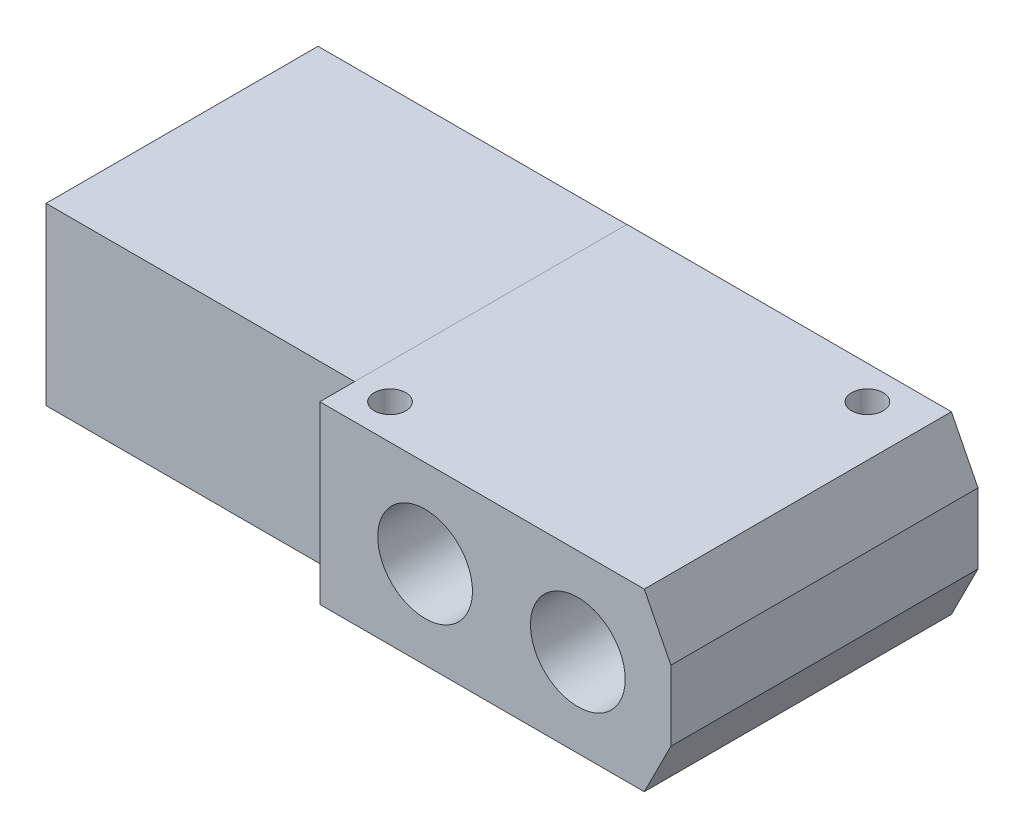
ISO-10303-21;
HEADER;
FILE_DESCRIPTION(('STEP AP214'),'2;1');
FILE_NAME('part.step','',(''),(''),'','','');
FILE_SCHEMA(('AUTOMOTIVE_DESIGN { 1 0 10303 214 1 1 1 1 }'));
ENDSEC;
DATA;
#1=APPLICATION_CONTEXT('core data for automotive mechanical design processes');
#2=APPLICATION_PROTOCOL_DEFINITION('international standard','automotive_design',2000,#1);
#3=PRODUCT_CONTEXT('',#1,'mechanical');
#4=PRODUCT('Part','Part','',(#3));
#5=PRODUCT_RELATED_PRODUCT_CATEGORY('part','',(#4));
#6=PRODUCT_DEFINITION_FORMATION('','',#4);
#7=PRODUCT_DEFINITION_CONTEXT('part definition',#1,'design');
#8=PRODUCT_DEFINITION('design','',#6,#7);
#9=PRODUCT_DEFINITION_SHAPE('','',#8);
#10=(LENGTH_UNIT() NAMED_UNIT(*) SI_UNIT(.MILLI.,.METRE.));
#11=(NAMED_UNIT(*) PLANE_ANGLE_UNIT() SI_UNIT($,.RADIAN.));
#12=(NAMED_UNIT(*) SI_UNIT($,.STERADIAN.) SOLID_ANGLE_UNIT());
#13=UNCERTAINTY_MEASURE_WITH_UNIT(LENGTH_MEASURE(1.E-05),#10,'distance_accuracy_value','');
#14=(GEOMETRIC_REPRESENTATION_CONTEXT(3) GLOBAL_UNCERTAINTY_ASSIGNED_CONTEXT((#13)) GLOBAL_UNIT_ASSIGNED_CONTEXT((#10,
#11,#12)) REPRESENTATION_CONTEXT('',''));
#15=CARTESIAN_POINT('',(0.,0.,0.));
#16=DIRECTION('',(0.,0.,1.));
#17=DIRECTION('',(1.,0.,0.));
#18=AXIS2_PLACEMENT_3D('',#15,#16,#17);
#19=CARTESIAN_POINT('',(95.504,25.4,5.08));
#20=DIRECTION('',(-1.,0.,0.));
#21=DIRECTION('',(0.,0.,1.));
#22=AXIS2_PLACEMENT_3D('',#19,#20,#21);
#23=PLANE('',#22);
#24=DIRECTION('',(0.,-1.,0.));
#25=VECTOR('',#24,1.);
#26=CARTESIAN_POINT('',(95.504,25.4,5.08));
#27=LINE('',#26,#25);
#28=CARTESIAN_POINT('',(95.504,17.78,5.08));
#29=VERTEX_POINT('',#28);
#30=CARTESIAN_POINT('',(95.504,7.62,5.08));
#31=VERTEX_POINT('',#30);
#32=EDGE_CURVE('E149',#29,#31,#27,.T.);
#33=ORIENTED_EDGE('',*,*,#32,.T.);
#34=DIRECTION('',(0.,0.,1.));
#35=VECTOR('',#34,1.);
#36=CARTESIAN_POINT('',(95.504,7.62,-39.37));
#37=LINE('',#36,#35);
#38=CARTESIAN_POINT('',(95.504,7.62,-39.37));
#39=VERTEX_POINT('',#38);
#40=EDGE_CURVE('E124',#39,#31,#37,.T.);
#41=ORIENTED_EDGE('',*,*,#40,.F.);
#42=DIRECTION('',(0.,-1.,0.));
#43=VECTOR('',#42,1.);
#44=CARTESIAN_POINT('',(95.504,25.4,-39.37));
#45=LINE('',#44,#43);
#46=CARTESIAN_POINT('',(95.504,17.78,-39.37));
#47=VERTEX_POINT('',#46);
#48=EDGE_CURVE('E11',#47,#39,#45,.T.);
#49=ORIENTED_EDGE('',*,*,#48,.F.);
#50=DIRECTION('',(0.,0.,1.));
#51=VECTOR('',#50,1.);
#52=CARTESIAN_POINT('',(95.504,17.78,-39.37));
#53=LINE('',#52,#51);
#54=EDGE_CURVE('E212',#47,#29,#53,.T.);
#55=ORIENTED_EDGE('',*,*,#54,.T.);
#56=EDGE_LOOP('',(#33,#41,#49,#55));
#57=FACE_BOUND('',#56,.T.);
#58=ADVANCED_FACE('F33',(#57),#23,.F.);
#59=CARTESIAN_POINT('',(0.,25.4,-39.37));
#60=DIRECTION('',(0.,0.,1.));
#61=DIRECTION('',(1.,0.,0.));
#62=AXIS2_PLACEMENT_3D('',#59,#60,#61);
#63=PLANE('',#62);
#64=CARTESIAN_POINT('',(69.85,12.7,-39.37));
#65=DIRECTION('',(0.,0.,-1.));
#66=DIRECTION('',(-1.,0.,0.));
#67=AXIS2_PLACEMENT_3D('',#64,#65,#66);
#68=CIRCLE('',#67,6.8545837);
#69=CARTESIAN_POINT('',(62.9954163,12.7,-39.37));
#70=VERTEX_POINT('',#69);
#71=EDGE_CURVE('E239',#70,#70,#68,.T.);
#72=ORIENTED_EDGE('',*,*,#71,.F.);
#73=EDGE_LOOP('',(#72));
#74=FACE_BOUND('',#73,.T.);
#75=ORIENTED_EDGE('',*,*,#48,.T.);
#76=DIRECTION('',(-0.450373433442575,-0.892840282720906,0.));
#77=VECTOR('',#76,1.);
#78=CARTESIAN_POINT('',(95.504,7.62,-39.37));
#79=LINE('',#78,#77);
#80=CARTESIAN_POINT('',(91.6602603869373,0.,-39.37));
#81=VERTEX_POINT('',#80);
#82=EDGE_CURVE('E118',#39,#81,#79,.T.);
#83=ORIENTED_EDGE('',*,*,#82,.T.);
#84=DIRECTION('',(-1.,0.,0.));
#85=VECTOR('',#84,1.);
#86=CARTESIAN_POINT('',(0.,0.,-39.37));
#87=LINE('',#86,#85);
#88=CARTESIAN_POINT('',(44.704,0.,-39.37));
#89=VERTEX_POINT('',#88);
#90=EDGE_CURVE('E129',#81,#89,#87,.T.);
#91=ORIENTED_EDGE('',*,*,#90,.T.);
#92=DIRECTION('',(0.,1.,0.));
#93=VECTOR('',#92,1.);
#94=CARTESIAN_POINT('',(44.704,0.,-39.37));
#95=LINE('',#94,#93);
#96=CARTESIAN_POINT('',(44.704,0.0254000000000018,-39.37));
#97=VERTEX_POINT('',#96);
#98=EDGE_CURVE('E174',#89,#97,#95,.T.);
#99=ORIENTED_EDGE('',*,*,#98,.T.);
#100=DIRECTION('',(-1.,0.,0.));
#101=VECTOR('',#100,1.);
#102=CARTESIAN_POINT('',(0.,0.0254000000000001,-39.37));
#103=LINE('',#102,#101);
#104=CARTESIAN_POINT('',(0.,0.0254000000000001,-39.37));
#105=VERTEX_POINT('',#104);
#106=EDGE_CURVE('E173',#97,#105,#103,.T.);
#107=ORIENTED_EDGE('',*,*,#106,.T.);
#108=DIRECTION('',(0.,-1.,0.));
#109=VECTOR('',#108,1.);
#110=CARTESIAN_POINT('',(0.,25.4,-39.37));
#111=LINE('',#110,#109);
#112=CARTESIAN_POINT('',(0.,25.3746,-39.37));
#113=VERTEX_POINT('',#112);
#114=EDGE_CURVE('E40',#113,#105,#111,.T.);
#115=ORIENTED_EDGE('',*,*,#114,.F.);
#116=DIRECTION('',(1.,0.,0.));
#117=VECTOR('',#116,1.);
#118=CARTESIAN_POINT('',(0.,25.3746,-39.37));
#119=LINE('',#118,#117);
#120=CARTESIAN_POINT('',(44.704,25.3746,-39.37));
#121=VERTEX_POINT('',#120);
#122=EDGE_CURVE('E171',#113,#121,#119,.T.);
#123=ORIENTED_EDGE('',*,*,#122,.T.);
#124=DIRECTION('',(0.,1.,0.));
#125=VECTOR('',#124,1.);
#126=CARTESIAN_POINT('',(44.704,25.4,-39.37));
#127=LINE('',#126,#125);
#128=CARTESIAN_POINT('',(44.704,25.4,-39.37));
#129=VERTEX_POINT('',#128);
#130=EDGE_CURVE('E188',#121,#129,#127,.T.);
#131=ORIENTED_EDGE('',*,*,#130,.T.);
#132=DIRECTION('',(-1.,0.,0.));
#133=VECTOR('',#132,1.);
#134=CARTESIAN_POINT('',(0.,25.4,-39.37));
#135=LINE('',#134,#133);
#136=CARTESIAN_POINT('',(91.6602603869373,25.4,-39.37));
#137=VERTEX_POINT('',#136);
#138=EDGE_CURVE('E148',#137,#129,#135,.T.);
#139=ORIENTED_EDGE('',*,*,#138,.F.);
#140=DIRECTION('',(0.450373433442575,-0.892840282720906,0.));
#141=VECTOR('',#140,1.);
#142=CARTESIAN_POINT('',(95.504,17.78,-39.37));
#143=LINE('',#142,#141);
#144=EDGE_CURVE('E55',#137,#47,#143,.T.);
#145=ORIENTED_EDGE('',*,*,#144,.T.);
#146=EDGE_LOOP('',(#75,#83,#91,#99,#107,#115,#123,#131,#139,#145));
#147=FACE_BOUND('',#146,.T.);
#148=ADVANCED_FACE('F127',(#74,#147),#63,.F.);
#149=CARTESIAN_POINT('',(0.,25.4,0.));
#150=DIRECTION('',(1.,0.,0.));
#151=DIRECTION('',(0.,0.,-1.));
#152=AXIS2_PLACEMENT_3D('',#149,#150,#151);
#153=PLANE('',#152);
#154=ORIENTED_EDGE('',*,*,#114,.T.);
#155=DIRECTION('',(0.,0.,1.));
#156=VECTOR('',#155,1.);
#157=CARTESIAN_POINT('',(0.,0.0254000000000001,-39.37));
#158=LINE('',#157,#156);
#159=CARTESIAN_POINT('',(0.,0.0254000000000001,0.));
#160=VERTEX_POINT('',#159);
#161=EDGE_CURVE('E167',#105,#160,#158,.T.);
#162=ORIENTED_EDGE('',*,*,#161,.T.);
#163=DIRECTION('',(0.,-1.,0.));
#164=VECTOR('',#163,1.);
#165=CARTESIAN_POINT('',(0.,25.4,0.));
#166=LINE('',#165,#164);
#167=CARTESIAN_POINT('',(0.,25.3746,0.));
#168=VERTEX_POINT('',#167);
#169=EDGE_CURVE('E158',#168,#160,#166,.T.);
#170=ORIENTED_EDGE('',*,*,#169,.F.);
#171=DIRECTION('',(0.,0.,1.));
#172=VECTOR('',#171,1.);
#173=CARTESIAN_POINT('',(0.,25.3746,-39.37));
#174=LINE('',#173,#172);
#175=EDGE_CURVE('E141',#113,#168,#174,.T.);
#176=ORIENTED_EDGE('',*,*,#175,.F.);
#177=EDGE_LOOP('',(#154,#162,#170,#176));
#178=FACE_BOUND('',#177,.T.);
#179=ADVANCED_FACE('F165',(#178),#153,.F.);
#180=CARTESIAN_POINT('',(0.,25.4,0.));
#181=DIRECTION('',(0.,0.,-1.));
#182=DIRECTION('',(-1.,0.,0.));
#183=AXIS2_PLACEMENT_3D('',#180,#181,#182);
#184=PLANE('',#183);
#185=ORIENTED_EDGE('',*,*,#169,.T.);
#186=DIRECTION('',(-1.,0.,0.));
#187=VECTOR('',#186,1.);
#188=CARTESIAN_POINT('',(0.,0.0254000000000001,0.));
#189=LINE('',#188,#187);
#190=CARTESIAN_POINT('',(44.704,0.0254000000000018,0.));
#191=VERTEX_POINT('',#190);
#192=EDGE_CURVE('E179',#191,#160,#189,.T.);
#193=ORIENTED_EDGE('',*,*,#192,.F.);
#194=DIRECTION('',(0.,-1.,0.));
#195=VECTOR('',#194,1.);
#196=CARTESIAN_POINT('',(44.704,25.4,0.));
#197=LINE('',#196,#195);
#198=CARTESIAN_POINT('',(44.704,25.3746,0.));
#199=VERTEX_POINT('',#198);
#200=EDGE_CURVE('E155',#199,#191,#197,.T.);
#201=ORIENTED_EDGE('',*,*,#200,.F.);
#202=DIRECTION('',(1.,0.,0.));
#203=VECTOR('',#202,1.);
#204=CARTESIAN_POINT('',(0.,25.3746,0.));
#205=LINE('',#204,#203);
#206=EDGE_CURVE('E185',#168,#199,#205,.T.);
#207=ORIENTED_EDGE('',*,*,#206,.F.);
#208=EDGE_LOOP('',(#185,#193,#201,#207));
#209=FACE_BOUND('',#208,.T.);
#210=ADVANCED_FACE('F291',(#209),#184,.F.);
#211=CARTESIAN_POINT('',(44.704,25.4,5.08));
#212=DIRECTION('',(1.,0.,0.));
#213=DIRECTION('',(0.,0.,-1.));
#214=AXIS2_PLACEMENT_3D('',#211,#212,#213);
#215=PLANE('',#214);
#216=DIRECTION('',(0.,0.,1.));
#217=VECTOR('',#216,1.);
#218=CARTESIAN_POINT('',(44.704,0.,5.08));
#219=LINE('',#218,#217);
#220=CARTESIAN_POINT('',(44.704,0.,5.08));
#221=VERTEX_POINT('',#220);
#222=EDGE_CURVE('E135',#89,#221,#219,.T.);
#223=ORIENTED_EDGE('',*,*,#222,.T.);
#224=DIRECTION('',(0.,-1.,0.));
#225=VECTOR('',#224,1.);
#226=CARTESIAN_POINT('',(44.704,25.4,5.08));
#227=LINE('',#226,#225);
#228=CARTESIAN_POINT('',(44.704,25.4,5.08));
#229=VERTEX_POINT('',#228);
#230=EDGE_CURVE('E152',#229,#221,#227,.T.);
#231=ORIENTED_EDGE('',*,*,#230,.F.);
#232=DIRECTION('',(0.,0.,1.));
#233=VECTOR('',#232,1.);
#234=CARTESIAN_POINT('',(44.704,25.4,5.08));
#235=LINE('',#234,#233);
#236=EDGE_CURVE('E193',#129,#229,#235,.T.);
#237=ORIENTED_EDGE('',*,*,#236,.F.);
#238=ORIENTED_EDGE('',*,*,#130,.F.);
#239=DIRECTION('',(0.,0.,1.));
#240=VECTOR('',#239,1.);
#241=CARTESIAN_POINT('',(44.704,25.3746,-39.37));
#242=LINE('',#241,#240);
#243=EDGE_CURVE('E137',#121,#199,#242,.T.);
#244=ORIENTED_EDGE('',*,*,#243,.T.);
#245=ORIENTED_EDGE('',*,*,#200,.T.);
#246=DIRECTION('',(0.,0.,1.));
#247=VECTOR('',#246,1.);
#248=CARTESIAN_POINT('',(44.704,0.0254000000000018,-39.37));
#249=LINE('',#248,#247);
#250=EDGE_CURVE('E176',#97,#191,#249,.T.);
#251=ORIENTED_EDGE('',*,*,#250,.F.);
#252=ORIENTED_EDGE('',*,*,#98,.F.);
#253=EDGE_LOOP('',(#223,#231,#237,#238,#244,#245,#251,#252));
#254=FACE_BOUND('',#253,.T.);
#255=ADVANCED_FACE('F273',(#254),#215,.F.);
#256=CARTESIAN_POINT('',(44.704,25.4,5.08));
#257=DIRECTION('',(0.,0.,-1.));
#258=DIRECTION('',(-1.,0.,0.));
#259=AXIS2_PLACEMENT_3D('',#256,#257,#258);
#260=PLANE('',#259);
#261=CARTESIAN_POINT('',(59.944,12.7,5.08000000000001));
#262=DIRECTION('',(0.,0.,1.));
#263=DIRECTION('',(1.,0.,0.));
#264=AXIS2_PLACEMENT_3D('',#261,#262,#263);
#265=CIRCLE('',#264,6.8545837);
#266=CARTESIAN_POINT('',(66.7985837,12.7,5.08000000000001));
#267=VERTEX_POINT('',#266);
#268=EDGE_CURVE('E214',#267,#267,#265,.T.);
#269=ORIENTED_EDGE('',*,*,#268,.F.);
#270=EDGE_LOOP('',(#269));
#271=FACE_BOUND('',#270,.T.);
#272=CARTESIAN_POINT('',(82.042,12.7,5.08000000000001));
#273=DIRECTION('',(0.,0.,1.));
#274=DIRECTION('',(1.,0.,0.));
#275=AXIS2_PLACEMENT_3D('',#272,#273,#274);
#276=CIRCLE('',#275,6.8545837);
#277=CARTESIAN_POINT('',(88.8965837,12.7,5.08000000000001));
#278=VERTEX_POINT('',#277);
#279=EDGE_CURVE('E227',#278,#278,#276,.T.);
#280=ORIENTED_EDGE('',*,*,#279,.F.);
#281=EDGE_LOOP('',(#280));
#282=FACE_BOUND('',#281,.T.);
#283=DIRECTION('',(1.,0.,0.));
#284=VECTOR('',#283,1.);
#285=CARTESIAN_POINT('',(44.704,0.,5.08));
#286=LINE('',#285,#284);
#287=CARTESIAN_POINT('',(91.6602603869373,0.,5.08));
#288=VERTEX_POINT('',#287);
#289=EDGE_CURVE('E139',#221,#288,#286,.T.);
#290=ORIENTED_EDGE('',*,*,#289,.T.);
#291=DIRECTION('',(-0.450373433442575,-0.892840282720906,0.));
#292=VECTOR('',#291,1.);
#293=CARTESIAN_POINT('',(95.504,7.62,5.08));
#294=LINE('',#293,#292);
#295=EDGE_CURVE('E47',#31,#288,#294,.T.);
#296=ORIENTED_EDGE('',*,*,#295,.F.);
#297=ORIENTED_EDGE('',*,*,#32,.F.);
#298=DIRECTION('',(0.450373433442575,-0.892840282720906,0.));
#299=VECTOR('',#298,1.);
#300=CARTESIAN_POINT('',(95.504,17.78,5.08));
#301=LINE('',#300,#299);
#302=CARTESIAN_POINT('',(91.6602603869373,25.4,5.08));
#303=VERTEX_POINT('',#302);
#304=EDGE_CURVE('E206',#303,#29,#301,.T.);
#305=ORIENTED_EDGE('',*,*,#304,.F.);
#306=DIRECTION('',(1.,0.,0.));
#307=VECTOR('',#306,1.);
#308=CARTESIAN_POINT('',(44.704,25.4,5.08));
#309=LINE('',#308,#307);
#310=EDGE_CURVE('E144',#229,#303,#309,.T.);
#311=ORIENTED_EDGE('',*,*,#310,.F.);
#312=ORIENTED_EDGE('',*,*,#230,.T.);
#313=EDGE_LOOP('',(#290,#296,#297,#305,#311,#312));
#314=FACE_BOUND('',#313,.T.);
#315=ADVANCED_FACE('F204',(#271,#282,#314),#260,.F.);
#316=CARTESIAN_POINT('',(0.,25.4,0.));
#317=DIRECTION('',(0.,-1.,0.));
#318=DIRECTION('',(0.,0.,-1.));
#319=AXIS2_PLACEMENT_3D('',#316,#317,#318);
#320=PLANE('',#319);
#321=CARTESIAN_POINT('',(84.328,25.4,-34.544));
#322=DIRECTION('',(0.,1.,0.));
#323=DIRECTION('',(0.,0.,1.));
#324=AXIS2_PLACEMENT_3D('',#321,#322,#323);
#325=CIRCLE('',#324,2.28599999999999);
#326=CARTESIAN_POINT('',(84.328,25.4,-32.258));
#327=VERTEX_POINT('',#326);
#328=EDGE_CURVE('E251',#327,#327,#325,.T.);
#329=ORIENTED_EDGE('',*,*,#328,.F.);
#330=EDGE_LOOP('',(#329));
#331=FACE_BOUND('',#330,.T.);
#332=CARTESIAN_POINT('',(49.784,25.4,0.));
#333=DIRECTION('',(0.,1.,0.));
#334=DIRECTION('',(0.,0.,1.));
#335=AXIS2_PLACEMENT_3D('',#332,#333,#334);
#336=CIRCLE('',#335,2.28599999999999);
#337=CARTESIAN_POINT('',(49.784,25.4,2.286));
#338=VERTEX_POINT('',#337);
#339=EDGE_CURVE('E255',#338,#338,#336,.T.);
#340=ORIENTED_EDGE('',*,*,#339,.F.);
#341=EDGE_LOOP('',(#340));
#342=FACE_BOUND('',#341,.T.);
#343=ORIENTED_EDGE('',*,*,#310,.T.);
#344=DIRECTION('',(0.,0.,1.));
#345=VECTOR('',#344,1.);
#346=CARTESIAN_POINT('',(91.6602603869373,25.4,-39.37));
#347=LINE('',#346,#345);
#348=EDGE_CURVE('E200',#137,#303,#347,.T.);
#349=ORIENTED_EDGE('',*,*,#348,.F.);
#350=ORIENTED_EDGE('',*,*,#138,.T.);
#351=ORIENTED_EDGE('',*,*,#236,.T.);
#352=EDGE_LOOP('',(#343,#349,#350,#351));
#353=FACE_BOUND('',#352,.T.);
#354=ADVANCED_FACE('F199',(#331,#342,#353),#320,.F.);
#355=CARTESIAN_POINT('',(0.,0.,0.));
#356=DIRECTION('',(0.,-1.,0.));
#357=DIRECTION('',(0.,0.,-1.));
#358=AXIS2_PLACEMENT_3D('',#355,#356,#357);
#359=PLANE('',#358);
#360=DIRECTION('',(0.,0.,1.));
#361=VECTOR('',#360,1.);
#362=CARTESIAN_POINT('',(91.6602603869373,0.,-39.37));
#363=LINE('',#362,#361);
#364=EDGE_CURVE('E115',#81,#288,#363,.T.);
#365=ORIENTED_EDGE('',*,*,#364,.T.);
#366=ORIENTED_EDGE('',*,*,#289,.F.);
#367=ORIENTED_EDGE('',*,*,#222,.F.);
#368=ORIENTED_EDGE('',*,*,#90,.F.);
#369=EDGE_LOOP('',(#365,#366,#367,#368));
#370=FACE_BOUND('',#369,.T.);
#371=CARTESIAN_POINT('',(84.328,0.,-34.544));
#372=DIRECTION('',(0.,1.,0.));
#373=DIRECTION('',(0.,0.,1.));
#374=AXIS2_PLACEMENT_3D('',#371,#372,#373);
#375=CIRCLE('',#374,2.28599999999999);
#376=CARTESIAN_POINT('',(84.328,0.,-32.258));
#377=VERTEX_POINT('',#376);
#378=EDGE_CURVE('E252',#377,#377,#375,.T.);
#379=ORIENTED_EDGE('',*,*,#378,.T.);
#380=EDGE_LOOP('',(#379));
#381=FACE_BOUND('',#380,.T.);
#382=CARTESIAN_POINT('',(49.784,0.,0.));
#383=DIRECTION('',(0.,1.,0.));
#384=DIRECTION('',(0.,0.,1.));
#385=AXIS2_PLACEMENT_3D('',#382,#383,#384);
#386=CIRCLE('',#385,2.28599999999999);
#387=CARTESIAN_POINT('',(49.784,0.,2.286));
#388=VERTEX_POINT('',#387);
#389=EDGE_CURVE('E184',#388,#388,#386,.T.);
#390=ORIENTED_EDGE('',*,*,#389,.T.);
#391=EDGE_LOOP('',(#390));
#392=FACE_BOUND('',#391,.T.);
#393=ADVANCED_FACE('F133',(#370,#381,#392),#359,.T.);
#394=CARTESIAN_POINT('',(0.,25.3746,-39.37));
#395=DIRECTION('',(0.,-1.,0.));
#396=DIRECTION('',(0.,0.,-1.));
#397=AXIS2_PLACEMENT_3D('',#394,#395,#396);
#398=PLANE('',#397);
#399=ORIENTED_EDGE('',*,*,#206,.T.);
#400=ORIENTED_EDGE('',*,*,#243,.F.);
#401=ORIENTED_EDGE('',*,*,#122,.F.);
#402=ORIENTED_EDGE('',*,*,#175,.T.);
#403=EDGE_LOOP('',(#399,#400,#401,#402));
#404=FACE_BOUND('',#403,.T.);
#405=ADVANCED_FACE('F271',(#404),#398,.F.);
#406=CARTESIAN_POINT('',(0.,0.0254000000000001,-39.37));
#407=DIRECTION('',(0.,1.,0.));
#408=DIRECTION('',(-1.,0.,0.));
#409=AXIS2_PLACEMENT_3D('',#406,#407,#408);
#410=PLANE('',#409);
#411=ORIENTED_EDGE('',*,*,#192,.T.);
#412=ORIENTED_EDGE('',*,*,#161,.F.);
#413=ORIENTED_EDGE('',*,*,#106,.F.);
#414=ORIENTED_EDGE('',*,*,#250,.T.);
#415=EDGE_LOOP('',(#411,#412,#413,#414));
#416=FACE_BOUND('',#415,.T.);
#417=ADVANCED_FACE('F289',(#416),#410,.F.);
#418=CARTESIAN_POINT('',(49.784,0.,0.));
#419=DIRECTION('',(0.,1.,0.));
#420=DIRECTION('',(0.,0.,1.));
#421=AXIS2_PLACEMENT_3D('',#418,#419,#420);
#422=CYLINDRICAL_SURFACE('',#421,2.28599999999999);
#423=ORIENTED_EDGE('',*,*,#389,.F.);
#424=EDGE_LOOP('',(#423));
#425=FACE_BOUND('',#424,.T.);
#426=ORIENTED_EDGE('',*,*,#339,.T.);
#427=EDGE_LOOP('',(#426));
#428=FACE_BOUND('',#427,.T.);
#429=ADVANCED_FACE('F262',(#425,#428),#422,.F.);
#430=CARTESIAN_POINT('',(84.328,0.,-34.544));
#431=DIRECTION('',(0.,1.,0.));
#432=DIRECTION('',(0.,0.,1.));
#433=AXIS2_PLACEMENT_3D('',#430,#431,#432);
#434=CYLINDRICAL_SURFACE('',#433,2.28599999999999);
#435=ORIENTED_EDGE('',*,*,#378,.F.);
#436=EDGE_LOOP('',(#435));
#437=FACE_BOUND('',#436,.T.);
#438=ORIENTED_EDGE('',*,*,#328,.T.);
#439=EDGE_LOOP('',(#438));
#440=FACE_BOUND('',#439,.T.);
#441=ADVANCED_FACE('F302',(#437,#440),#434,.F.);
#442=CARTESIAN_POINT('',(69.85,12.7,-22.352));
#443=DIRECTION('',(0.,0.,-1.));
#444=DIRECTION('',(-1.,0.,0.));
#445=AXIS2_PLACEMENT_3D('',#442,#443,#444);
#446=CONICAL_SURFACE('',#445,5.56260000000001,1.02974425867665);
#447=CARTESIAN_POINT('',(69.85,12.7,-19.0096527205973));
#448=VERTEX_POINT('',#447);
#449=VERTEX_LOOP('',#448);
#450=FACE_BOUND('',#449,.T.);
#451=CARTESIAN_POINT('',(69.85,12.7,-22.352));
#452=DIRECTION('',(0.,0.,-1.));
#453=DIRECTION('',(-1.,0.,0.));
#454=AXIS2_PLACEMENT_3D('',#451,#452,#453);
#455=CIRCLE('',#454,5.56260000000001);
#456=CARTESIAN_POINT('',(64.2874,12.7,-22.352));
#457=VERTEX_POINT('',#456);
#458=EDGE_CURVE('E248',#457,#457,#455,.T.);
#459=ORIENTED_EDGE('',*,*,#458,.T.);
#460=EDGE_LOOP('',(#459));
#461=FACE_BOUND('',#460,.T.);
#462=ADVANCED_FACE('F306',(#450,#461),#446,.F.);
#463=CARTESIAN_POINT('',(69.85,12.7,-39.37));
#464=DIRECTION('',(0.,0.,-1.));
#465=DIRECTION('',(-1.,0.,0.));
#466=AXIS2_PLACEMENT_3D('',#463,#464,#465);
#467=CYLINDRICAL_SURFACE('',#466,5.56260000000001);
#468=ORIENTED_EDGE('',*,*,#458,.F.);
#469=EDGE_LOOP('',(#468));
#470=FACE_BOUND('',#469,.T.);
#471=CARTESIAN_POINT('',(69.85,12.7,-29.464));
#472=DIRECTION('',(0.,0.,-1.));
#473=DIRECTION('',(-1.,0.,0.));
#474=AXIS2_PLACEMENT_3D('',#471,#472,#473);
#475=CIRCLE('',#474,5.5626);
#476=CARTESIAN_POINT('',(64.2874,12.7,-29.464));
#477=VERTEX_POINT('',#476);
#478=EDGE_CURVE('E245',#477,#477,#475,.T.);
#479=ORIENTED_EDGE('',*,*,#478,.T.);
#480=EDGE_LOOP('',(#479));
#481=FACE_BOUND('',#480,.T.);
#482=ADVANCED_FACE('F310',(#470,#481),#467,.F.);
#483=CARTESIAN_POINT('',(75.4126,12.7,-29.464));
#484=DIRECTION('',(0.,0.,1.));
#485=DIRECTION('',(1.,0.,0.));
#486=AXIS2_PLACEMENT_3D('',#483,#484,#485);
#487=PLANE('',#486);
#488=ORIENTED_EDGE('',*,*,#478,.F.);
#489=EDGE_LOOP('',(#488));
#490=FACE_BOUND('',#489,.T.);
#491=CARTESIAN_POINT('',(69.85,12.7,-29.464));
#492=DIRECTION('',(0.,0.,-1.));
#493=DIRECTION('',(-1.,0.,0.));
#494=AXIS2_PLACEMENT_3D('',#491,#492,#493);
#495=CIRCLE('',#494,6.55798479417671);
#496=CARTESIAN_POINT('',(63.2920152058233,12.7,-29.464));
#497=VERTEX_POINT('',#496);
#498=EDGE_CURVE('E242',#497,#497,#495,.T.);
#499=ORIENTED_EDGE('',*,*,#498,.T.);
#500=EDGE_LOOP('',(#499));
#501=FACE_BOUND('',#500,.T.);
#502=ADVANCED_FACE('F314',(#490,#501),#487,.F.);
#503=CARTESIAN_POINT('',(69.85,12.7,-39.37));
#504=DIRECTION('',(0.,0.,-1.));
#505=DIRECTION('',(-1.,0.,0.));
#506=AXIS2_PLACEMENT_3D('',#503,#504,#505);
#507=CONICAL_SURFACE('',#506,6.8545837,0.0299323966717032);
#508=ORIENTED_EDGE('',*,*,#498,.F.);
#509=EDGE_LOOP('',(#508));
#510=FACE_BOUND('',#509,.T.);
#511=ORIENTED_EDGE('',*,*,#71,.T.);
#512=EDGE_LOOP('',(#511));
#513=FACE_BOUND('',#512,.T.);
#514=ADVANCED_FACE('F318',(#510,#513),#507,.F.);
#515=CARTESIAN_POINT('',(82.042,12.7,-11.938));
#516=DIRECTION('',(0.,0.,1.));
#517=DIRECTION('',(1.,0.,0.));
#518=AXIS2_PLACEMENT_3D('',#515,#516,#517);
#519=CONICAL_SURFACE('',#518,5.56260000000001,1.02974425867665);
#520=CARTESIAN_POINT('',(82.042,12.7,-15.2803472794027));
#521=VERTEX_POINT('',#520);
#522=VERTEX_LOOP('',#521);
#523=FACE_BOUND('',#522,.T.);
#524=CARTESIAN_POINT('',(82.042,12.7,-11.938));
#525=DIRECTION('',(0.,0.,1.));
#526=DIRECTION('',(1.,0.,0.));
#527=AXIS2_PLACEMENT_3D('',#524,#525,#526);
#528=CIRCLE('',#527,5.56260000000001);
#529=CARTESIAN_POINT('',(87.6046,12.7,-11.938));
#530=VERTEX_POINT('',#529);
#531=EDGE_CURVE('E236',#530,#530,#528,.T.);
#532=ORIENTED_EDGE('',*,*,#531,.T.);
#533=EDGE_LOOP('',(#532));
#534=FACE_BOUND('',#533,.T.);
#535=ADVANCED_FACE('F322',(#523,#534),#519,.F.);
#536=CARTESIAN_POINT('',(82.042,12.7,5.08));
#537=DIRECTION('',(0.,0.,1.));
#538=DIRECTION('',(1.,0.,0.));
#539=AXIS2_PLACEMENT_3D('',#536,#537,#538);
#540=CYLINDRICAL_SURFACE('',#539,5.56260000000001);
#541=ORIENTED_EDGE('',*,*,#531,.F.);
#542=EDGE_LOOP('',(#541));
#543=FACE_BOUND('',#542,.T.);
#544=CARTESIAN_POINT('',(82.042,12.7,-4.826));
#545=DIRECTION('',(0.,0.,1.));
#546=DIRECTION('',(1.,0.,0.));
#547=AXIS2_PLACEMENT_3D('',#544,#545,#546);
#548=CIRCLE('',#547,5.5626);
#549=CARTESIAN_POINT('',(87.6046,12.7,-4.826));
#550=VERTEX_POINT('',#549);
#551=EDGE_CURVE('E233',#550,#550,#548,.T.);
#552=ORIENTED_EDGE('',*,*,#551,.T.);
#553=EDGE_LOOP('',(#552));
#554=FACE_BOUND('',#553,.T.);
#555=ADVANCED_FACE('F326',(#543,#554),#540,.F.);
#556=CARTESIAN_POINT('',(87.6046,12.7,-4.826));
#557=DIRECTION('',(0.,0.,-1.));
#558=DIRECTION('',(-1.,0.,0.));
#559=AXIS2_PLACEMENT_3D('',#556,#557,#558);
#560=PLANE('',#559);
#561=ORIENTED_EDGE('',*,*,#551,.F.);
#562=EDGE_LOOP('',(#561));
#563=FACE_BOUND('',#562,.T.);
#564=CARTESIAN_POINT('',(82.042,12.7,-4.826));
#565=DIRECTION('',(0.,0.,1.));
#566=DIRECTION('',(1.,0.,0.));
#567=AXIS2_PLACEMENT_3D('',#564,#565,#566);
#568=CIRCLE('',#567,6.55798479417671);
#569=CARTESIAN_POINT('',(88.5999847941767,12.7,-4.826));
#570=VERTEX_POINT('',#569);
#571=EDGE_CURVE('E230',#570,#570,#568,.T.);
#572=ORIENTED_EDGE('',*,*,#571,.T.);
#573=EDGE_LOOP('',(#572));
#574=FACE_BOUND('',#573,.T.);
#575=ADVANCED_FACE('F330',(#563,#574),#560,.F.);
#576=CARTESIAN_POINT('',(82.042,12.7,5.08000000000001));
#577=DIRECTION('',(0.,0.,1.));
#578=DIRECTION('',(1.,0.,0.));
#579=AXIS2_PLACEMENT_3D('',#576,#577,#578);
#580=CONICAL_SURFACE('',#579,6.8545837,0.0299323966717032);
#581=ORIENTED_EDGE('',*,*,#571,.F.);
#582=EDGE_LOOP('',(#581));
#583=FACE_BOUND('',#582,.T.);
#584=ORIENTED_EDGE('',*,*,#279,.T.);
#585=EDGE_LOOP('',(#584));
#586=FACE_BOUND('',#585,.T.);
#587=ADVANCED_FACE('F334',(#583,#586),#580,.F.);
#588=CARTESIAN_POINT('',(59.944,12.7,-11.938));
#589=DIRECTION('',(0.,0.,1.));
#590=DIRECTION('',(1.,0.,0.));
#591=AXIS2_PLACEMENT_3D('',#588,#589,#590);
#592=CONICAL_SURFACE('',#591,5.56260000000001,1.02974425867665);
#593=CARTESIAN_POINT('',(59.944,12.7,-15.2803472794027));
#594=VERTEX_POINT('',#593);
#595=VERTEX_LOOP('',#594);
#596=FACE_BOUND('',#595,.T.);
#597=CARTESIAN_POINT('',(59.944,12.7,-11.938));
#598=DIRECTION('',(0.,0.,1.));
#599=DIRECTION('',(1.,0.,0.));
#600=AXIS2_PLACEMENT_3D('',#597,#598,#599);
#601=CIRCLE('',#600,5.56260000000001);
#602=CARTESIAN_POINT('',(65.5066,12.7,-11.938));
#603=VERTEX_POINT('',#602);
#604=EDGE_CURVE('E224',#603,#603,#601,.T.);
#605=ORIENTED_EDGE('',*,*,#604,.T.);
#606=EDGE_LOOP('',(#605));
#607=FACE_BOUND('',#606,.T.);
#608=ADVANCED_FACE('F338',(#596,#607),#592,.F.);
#609=CARTESIAN_POINT('',(59.944,12.7,5.08));
#610=DIRECTION('',(0.,0.,1.));
#611=DIRECTION('',(1.,0.,0.));
#612=AXIS2_PLACEMENT_3D('',#609,#610,#611);
#613=CYLINDRICAL_SURFACE('',#612,5.56260000000001);
#614=ORIENTED_EDGE('',*,*,#604,.F.);
#615=EDGE_LOOP('',(#614));
#616=FACE_BOUND('',#615,.T.);
#617=CARTESIAN_POINT('',(59.944,12.7,-4.826));
#618=DIRECTION('',(0.,0.,1.));
#619=DIRECTION('',(1.,0.,0.));
#620=AXIS2_PLACEMENT_3D('',#617,#618,#619);
#621=CIRCLE('',#620,5.5626);
#622=CARTESIAN_POINT('',(65.5066,12.7,-4.826));
#623=VERTEX_POINT('',#622);
#624=EDGE_CURVE('E221',#623,#623,#621,.T.);
#625=ORIENTED_EDGE('',*,*,#624,.T.);
#626=EDGE_LOOP('',(#625));
#627=FACE_BOUND('',#626,.T.);
#628=ADVANCED_FACE('F342',(#616,#627),#613,.F.);
#629=CARTESIAN_POINT('',(65.5066,12.7,-4.826));
#630=DIRECTION('',(0.,0.,-1.));
#631=DIRECTION('',(-1.,0.,0.));
#632=AXIS2_PLACEMENT_3D('',#629,#630,#631);
#633=PLANE('',#632);
#634=ORIENTED_EDGE('',*,*,#624,.F.);
#635=EDGE_LOOP('',(#634));
#636=FACE_BOUND('',#635,.T.);
#637=CARTESIAN_POINT('',(59.944,12.7,-4.826));
#638=DIRECTION('',(0.,0.,1.));
#639=DIRECTION('',(1.,0.,0.));
#640=AXIS2_PLACEMENT_3D('',#637,#638,#639);
#641=CIRCLE('',#640,6.55798479417671);
#642=CARTESIAN_POINT('',(66.5019847941767,12.7,-4.826));
#643=VERTEX_POINT('',#642);
#644=EDGE_CURVE('E218',#643,#643,#641,.T.);
#645=ORIENTED_EDGE('',*,*,#644,.T.);
#646=EDGE_LOOP('',(#645));
#647=FACE_BOUND('',#646,.T.);
#648=ADVANCED_FACE('F346',(#636,#647),#633,.F.);
#649=CARTESIAN_POINT('',(59.944,12.7,5.08000000000001));
#650=DIRECTION('',(0.,0.,1.));
#651=DIRECTION('',(1.,0.,0.));
#652=AXIS2_PLACEMENT_3D('',#649,#650,#651);
#653=CONICAL_SURFACE('',#652,6.8545837,0.0299323966717032);
#654=ORIENTED_EDGE('',*,*,#644,.F.);
#655=EDGE_LOOP('',(#654));
#656=FACE_BOUND('',#655,.T.);
#657=ORIENTED_EDGE('',*,*,#268,.T.);
#658=EDGE_LOOP('',(#657));
#659=FACE_BOUND('',#658,.T.);
#660=ADVANCED_FACE('F350',(#656,#659),#653,.F.);
#661=CARTESIAN_POINT('',(95.504,17.78,-39.37));
#662=DIRECTION('',(-0.892840282720906,-0.450373433442575,0.));
#663=DIRECTION('',(0.450373433442575,-0.892840282720906,0.));
#664=AXIS2_PLACEMENT_3D('',#661,#662,#663);
#665=PLANE('',#664);
#666=ORIENTED_EDGE('',*,*,#304,.T.);
#667=ORIENTED_EDGE('',*,*,#54,.F.);
#668=ORIENTED_EDGE('',*,*,#144,.F.);
#669=ORIENTED_EDGE('',*,*,#348,.T.);
#670=EDGE_LOOP('',(#666,#667,#668,#669));
#671=FACE_BOUND('',#670,.T.);
#672=ADVANCED_FACE('F284',(#671),#665,.F.);
#673=CARTESIAN_POINT('',(95.504,7.62,-39.37));
#674=DIRECTION('',(-0.892840282720906,0.450373433442575,0.));
#675=DIRECTION('',(-0.450373433442575,-0.892840282720906,0.));
#676=AXIS2_PLACEMENT_3D('',#673,#674,#675);
#677=PLANE('',#676);
#678=ORIENTED_EDGE('',*,*,#295,.T.);
#679=ORIENTED_EDGE('',*,*,#364,.F.);
#680=ORIENTED_EDGE('',*,*,#82,.F.);
#681=ORIENTED_EDGE('',*,*,#40,.T.);
#682=EDGE_LOOP('',(#678,#679,#680,#681));
#683=FACE_BOUND('',#682,.T.);
#684=ADVANCED_FACE('F117',(#683),#677,.F.);
#685=CLOSED_SHELL('',(#58,#148,#179,#210,#255,#315,#354,#393,#405,#417,#429,#441,#462,#482,#502,
#514,#535,#555,#575,#587,#608,#628,#648,#660,#672,#684));
#686=MANIFOLD_SOLID_BREP('B2',#685);
#687=ADVANCED_BREP_SHAPE_REPRESENTATION('',(#18,#686),#14);
#688=SHAPE_DEFINITION_REPRESENTATION(#9,#687);
ENDSEC;
END-ISO-10303-21;
